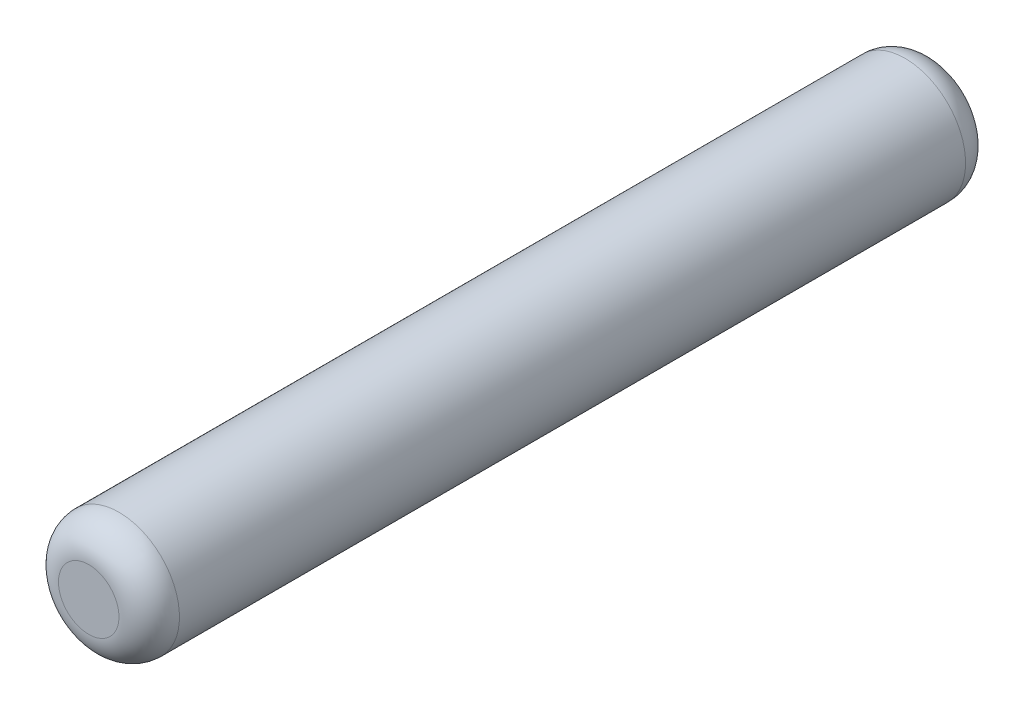
ISO-10303-21;
HEADER;
FILE_DESCRIPTION(('STEP AP214'),'2;1');
FILE_NAME('part.step','',(''),(''),'','','');
FILE_SCHEMA(('AUTOMOTIVE_DESIGN { 1 0 10303 214 1 1 1 1 }'));
ENDSEC;
DATA;
#1=APPLICATION_CONTEXT('core data for automotive mechanical design processes');
#2=APPLICATION_PROTOCOL_DEFINITION('international standard','automotive_design',2000,#1);
#3=PRODUCT_CONTEXT('',#1,'mechanical');
#4=PRODUCT('Part','Part','',(#3));
#5=PRODUCT_RELATED_PRODUCT_CATEGORY('part','',(#4));
#6=PRODUCT_DEFINITION_FORMATION('','',#4);
#7=PRODUCT_DEFINITION_CONTEXT('part definition',#1,'design');
#8=PRODUCT_DEFINITION('design','',#6,#7);
#9=PRODUCT_DEFINITION_SHAPE('','',#8);
#10=(LENGTH_UNIT() NAMED_UNIT(*) SI_UNIT(.MILLI.,.METRE.));
#11=(NAMED_UNIT(*) PLANE_ANGLE_UNIT() SI_UNIT($,.RADIAN.));
#12=(NAMED_UNIT(*) SI_UNIT($,.STERADIAN.) SOLID_ANGLE_UNIT());
#13=UNCERTAINTY_MEASURE_WITH_UNIT(LENGTH_MEASURE(1.E-05),#10,'distance_accuracy_value','');
#14=(GEOMETRIC_REPRESENTATION_CONTEXT(3) GLOBAL_UNCERTAINTY_ASSIGNED_CONTEXT((#13)) GLOBAL_UNIT_ASSIGNED_CONTEXT((#10,
#11,#12)) REPRESENTATION_CONTEXT('',''));
#15=CARTESIAN_POINT('',(0.,0.,0.));
#16=DIRECTION('',(0.,0.,1.));
#17=DIRECTION('',(1.,0.,0.));
#18=AXIS2_PLACEMENT_3D('',#15,#16,#17);
#19=CARTESIAN_POINT('',(0.,0.,13.));
#20=DIRECTION('',(0.,0.,-1.));
#21=DIRECTION('',(-1.,0.,0.));
#22=AXIS2_PLACEMENT_3D('',#19,#20,#21);
#23=DEGENERATE_TOROIDAL_SURFACE('',#22,1.,1.,.T.);
#24=CARTESIAN_POINT('',(0.,0.,14.));
#25=DIRECTION('',(0.,0.,-1.));
#26=DIRECTION('',(-1.,0.,0.));
#27=AXIS2_PLACEMENT_3D('',#24,#25,#26);
#28=CIRCLE('',#27,1.);
#29=CARTESIAN_POINT('',(-1.,0.,14.));
#30=VERTEX_POINT('',#29);
#31=EDGE_CURVE('E10',#30,#30,#28,.T.);
#32=ORIENTED_EDGE('',*,*,#31,.T.);
#33=EDGE_LOOP('',(#32));
#34=FACE_BOUND('',#33,.T.);
#35=CARTESIAN_POINT('',(0.,0.,13.));
#36=DIRECTION('',(0.,0.,-1.));
#37=DIRECTION('',(-1.,0.,0.));
#38=AXIS2_PLACEMENT_3D('',#35,#36,#37);
#39=CIRCLE('',#38,2.);
#40=CARTESIAN_POINT('',(-2.,0.,13.));
#41=VERTEX_POINT('',#40);
#42=EDGE_CURVE('E51',#41,#41,#39,.T.);
#43=ORIENTED_EDGE('',*,*,#42,.F.);
#44=EDGE_LOOP('',(#43));
#45=FACE_BOUND('',#44,.T.);
#46=ADVANCED_FACE('F37',(#34,#45),#23,.T.);
#47=CARTESIAN_POINT('',(1.,0.,14.));
#48=DIRECTION('',(0.,0.,1.));
#49=DIRECTION('',(1.,0.,0.));
#50=AXIS2_PLACEMENT_3D('',#47,#48,#49);
#51=PLANE('',#50);
#52=ORIENTED_EDGE('',*,*,#31,.F.);
#53=EDGE_LOOP('',(#52));
#54=FACE_BOUND('',#53,.T.);
#55=ADVANCED_FACE('F61',(#54),#51,.T.);
#56=CARTESIAN_POINT('',(0.,0.,-14.));
#57=DIRECTION('',(0.,0.,-1.));
#58=DIRECTION('',(-1.,0.,0.));
#59=AXIS2_PLACEMENT_3D('',#56,#57,#58);
#60=PLANE('',#59);
#61=CARTESIAN_POINT('',(0.,0.,-14.));
#62=DIRECTION('',(0.,0.,-1.));
#63=DIRECTION('',(-1.,0.,0.));
#64=AXIS2_PLACEMENT_3D('',#61,#62,#63);
#65=CIRCLE('',#64,1.);
#66=CARTESIAN_POINT('',(-1.,0.,-14.));
#67=VERTEX_POINT('',#66);
#68=EDGE_CURVE('E43',#67,#67,#65,.T.);
#69=ORIENTED_EDGE('',*,*,#68,.T.);
#70=EDGE_LOOP('',(#69));
#71=FACE_BOUND('',#70,.T.);
#72=ADVANCED_FACE('F65',(#71),#60,.T.);
#73=CARTESIAN_POINT('',(0.,0.,-13.));
#74=DIRECTION('',(0.,0.,-1.));
#75=DIRECTION('',(-1.,0.,0.));
#76=AXIS2_PLACEMENT_3D('',#73,#74,#75);
#77=DEGENERATE_TOROIDAL_SURFACE('',#76,1.,1.,.T.);
#78=CARTESIAN_POINT('',(0.,0.,-13.));
#79=DIRECTION('',(0.,0.,-1.));
#80=DIRECTION('',(-1.,0.,0.));
#81=AXIS2_PLACEMENT_3D('',#78,#79,#80);
#82=CIRCLE('',#81,2.);
#83=CARTESIAN_POINT('',(-2.,0.,-13.));
#84=VERTEX_POINT('',#83);
#85=EDGE_CURVE('E47',#84,#84,#82,.T.);
#86=ORIENTED_EDGE('',*,*,#85,.T.);
#87=EDGE_LOOP('',(#86));
#88=FACE_BOUND('',#87,.T.);
#89=ORIENTED_EDGE('',*,*,#68,.F.);
#90=EDGE_LOOP('',(#89));
#91=FACE_BOUND('',#90,.T.);
#92=ADVANCED_FACE('F70',(#88,#91),#77,.T.);
#93=CARTESIAN_POINT('',(0.,0.,14.));
#94=DIRECTION('',(0.,0.,-1.));
#95=DIRECTION('',(-1.,0.,0.));
#96=AXIS2_PLACEMENT_3D('',#93,#94,#95);
#97=CYLINDRICAL_SURFACE('',#96,2.);
#98=ORIENTED_EDGE('',*,*,#42,.T.);
#99=EDGE_LOOP('',(#98));
#100=FACE_BOUND('',#99,.T.);
#101=ORIENTED_EDGE('',*,*,#85,.F.);
#102=EDGE_LOOP('',(#101));
#103=FACE_BOUND('',#102,.T.);
#104=ADVANCED_FACE('F57',(#100,#103),#97,.T.);
#105=CLOSED_SHELL('',(#46,#55,#72,#92,#104));
#106=MANIFOLD_SOLID_BREP('B2',#105);
#107=ADVANCED_BREP_SHAPE_REPRESENTATION('',(#18,#106),#14);
#108=SHAPE_DEFINITION_REPRESENTATION(#9,#107);
ENDSEC;
END-ISO-10303-21;
